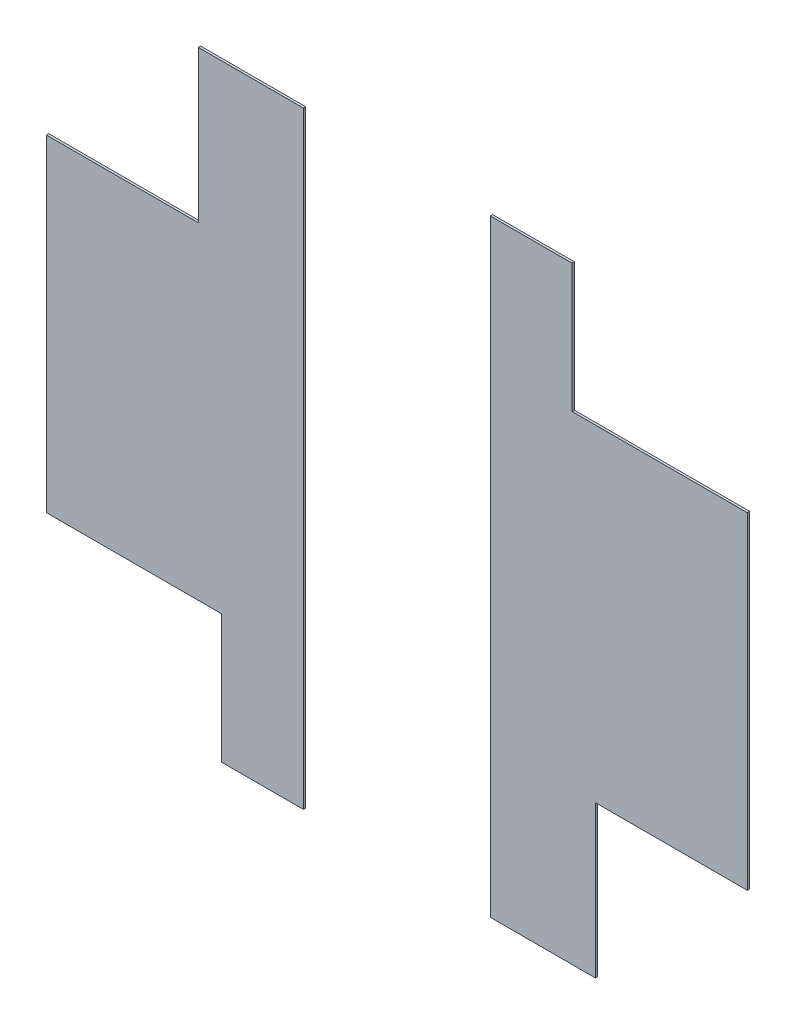
ISO-10303-21;
HEADER;
FILE_DESCRIPTION(('STEP AP214'),'2;1');
FILE_NAME('part.step','',(''),(''),'','','');
FILE_SCHEMA(('AUTOMOTIVE_DESIGN { 1 0 10303 214 1 1 1 1 }'));
ENDSEC;
DATA;
#1=APPLICATION_CONTEXT('core data for automotive mechanical design processes');
#2=APPLICATION_PROTOCOL_DEFINITION('international standard','automotive_design',2000,#1);
#3=PRODUCT_CONTEXT('',#1,'mechanical');
#4=PRODUCT('Part','Part','',(#3));
#5=PRODUCT_RELATED_PRODUCT_CATEGORY('part','',(#4));
#6=PRODUCT_DEFINITION_FORMATION('','',#4);
#7=PRODUCT_DEFINITION_CONTEXT('part definition',#1,'design');
#8=PRODUCT_DEFINITION('design','',#6,#7);
#9=PRODUCT_DEFINITION_SHAPE('','',#8);
#10=(LENGTH_UNIT() NAMED_UNIT(*) SI_UNIT(.MILLI.,.METRE.));
#11=(NAMED_UNIT(*) PLANE_ANGLE_UNIT() SI_UNIT($,.RADIAN.));
#12=(NAMED_UNIT(*) SI_UNIT($,.STERADIAN.) SOLID_ANGLE_UNIT());
#13=UNCERTAINTY_MEASURE_WITH_UNIT(LENGTH_MEASURE(1.E-05),#10,'distance_accuracy_value','');
#14=(GEOMETRIC_REPRESENTATION_CONTEXT(3) GLOBAL_UNCERTAINTY_ASSIGNED_CONTEXT((#13)) GLOBAL_UNIT_ASSIGNED_CONTEXT((#10,
#11,#12)) REPRESENTATION_CONTEXT('',''));
#15=CARTESIAN_POINT('',(0.,0.,0.));
#16=DIRECTION('',(0.,0.,1.));
#17=DIRECTION('',(1.,0.,0.));
#18=AXIS2_PLACEMENT_3D('',#15,#16,#17);
#19=CARTESIAN_POINT('',(0.,660.4,2.54));
#20=DIRECTION('',(0.,-1.,0.));
#21=DIRECTION('',(0.,0.,-1.));
#22=AXIS2_PLACEMENT_3D('',#19,#20,#21);
#23=PLANE('',#22);
#24=DIRECTION('',(-1.,0.,0.));
#25=VECTOR('',#24,1.);
#26=CARTESIAN_POINT('',(0.,660.4,0.));
#27=LINE('',#26,#25);
#28=CARTESIAN_POINT('',(-190.5,660.4,0.));
#29=VERTEX_POINT('',#28);
#30=CARTESIAN_POINT('',(-279.4,660.4,0.));
#31=VERTEX_POINT('',#30);
#32=EDGE_CURVE('E49',#29,#31,#27,.T.);
#33=ORIENTED_EDGE('',*,*,#32,.T.);
#34=DIRECTION('',(0.,0.,1.));
#35=VECTOR('',#34,1.);
#36=CARTESIAN_POINT('',(-279.4,660.4,0.));
#37=LINE('',#36,#35);
#38=CARTESIAN_POINT('',(-279.4,660.4,2.54));
#39=VERTEX_POINT('',#38);
#40=EDGE_CURVE('E139',#31,#39,#37,.T.);
#41=ORIENTED_EDGE('',*,*,#40,.T.);
#42=DIRECTION('',(-1.,0.,0.));
#43=VECTOR('',#42,1.);
#44=CARTESIAN_POINT('',(0.,660.4,2.54));
#45=LINE('',#44,#43);
#46=CARTESIAN_POINT('',(-190.5,660.4,2.54));
#47=VERTEX_POINT('',#46);
#48=EDGE_CURVE('E168',#47,#39,#45,.T.);
#49=ORIENTED_EDGE('',*,*,#48,.F.);
#50=DIRECTION('',(0.,0.,1.));
#51=VECTOR('',#50,1.);
#52=CARTESIAN_POINT('',(-190.5,660.4,0.));
#53=LINE('',#52,#51);
#54=EDGE_CURVE('E133',#29,#47,#53,.T.);
#55=ORIENTED_EDGE('',*,*,#54,.F.);
#56=EDGE_LOOP('',(#33,#41,#49,#55));
#57=FACE_BOUND('',#56,.T.);
#58=ADVANCED_FACE('F46',(#57),#23,.F.);
#59=CARTESIAN_POINT('',(0.,0.,2.54));
#60=DIRECTION('',(0.,1.,0.));
#61=DIRECTION('',(0.,0.,1.));
#62=AXIS2_PLACEMENT_3D('',#59,#60,#61);
#63=PLANE('',#62);
#64=DIRECTION('',(1.,0.,0.));
#65=VECTOR('',#64,1.);
#66=CARTESIAN_POINT('',(0.,0.,2.54));
#67=LINE('',#66,#65);
#68=CARTESIAN_POINT('',(-279.4,0.,2.54));
#69=VERTEX_POINT('',#68);
#70=CARTESIAN_POINT('',(-165.1,0.,2.54));
#71=VERTEX_POINT('',#70);
#72=EDGE_CURVE('E115',#69,#71,#67,.T.);
#73=ORIENTED_EDGE('',*,*,#72,.F.);
#74=DIRECTION('',(0.,0.,1.));
#75=VECTOR('',#74,1.);
#76=CARTESIAN_POINT('',(-279.4,0.,0.));
#77=LINE('',#76,#75);
#78=CARTESIAN_POINT('',(-279.4,0.,0.));
#79=VERTEX_POINT('',#78);
#80=EDGE_CURVE('E12',#79,#69,#77,.T.);
#81=ORIENTED_EDGE('',*,*,#80,.F.);
#82=DIRECTION('',(1.,0.,0.));
#83=VECTOR('',#82,1.);
#84=CARTESIAN_POINT('',(0.,0.,0.));
#85=LINE('',#84,#83);
#86=CARTESIAN_POINT('',(-165.1,0.,0.));
#87=VERTEX_POINT('',#86);
#88=EDGE_CURVE('E137',#79,#87,#85,.T.);
#89=ORIENTED_EDGE('',*,*,#88,.T.);
#90=DIRECTION('',(0.,0.,1.));
#91=VECTOR('',#90,1.);
#92=CARTESIAN_POINT('',(-165.1,0.,0.));
#93=LINE('',#92,#91);
#94=EDGE_CURVE('E123',#87,#71,#93,.T.);
#95=ORIENTED_EDGE('',*,*,#94,.T.);
#96=EDGE_LOOP('',(#73,#81,#89,#95));
#97=FACE_BOUND('',#96,.T.);
#98=ADVANCED_FACE('F135',(#97),#63,.F.);
#99=CARTESIAN_POINT('',(0.,0.,2.54));
#100=DIRECTION('',(0.,0.,1.));
#101=DIRECTION('',(1.,0.,0.));
#102=AXIS2_PLACEMENT_3D('',#99,#100,#101);
#103=PLANE('',#102);
#104=DIRECTION('',(0.,1.,0.));
#105=VECTOR('',#104,1.);
#106=CARTESIAN_POINT('',(-279.4,660.4,2.54));
#107=LINE('',#106,#105);
#108=EDGE_CURVE('E55',#69,#39,#107,.T.);
#109=ORIENTED_EDGE('',*,*,#108,.F.);
#110=ORIENTED_EDGE('',*,*,#72,.T.);
#111=DIRECTION('',(0.,-1.,0.));
#112=VECTOR('',#111,1.);
#113=CARTESIAN_POINT('',(-165.1,0.,2.54));
#114=LINE('',#113,#112);
#115=CARTESIAN_POINT('',(-165.1,165.1,2.54));
#116=VERTEX_POINT('',#115);
#117=EDGE_CURVE('E118',#116,#71,#114,.T.);
#118=ORIENTED_EDGE('',*,*,#117,.F.);
#119=DIRECTION('',(-1.,0.,0.));
#120=VECTOR('',#119,1.);
#121=CARTESIAN_POINT('',(0.,165.1,2.54));
#122=LINE('',#121,#120);
#123=CARTESIAN_POINT('',(0.,165.1,2.54));
#124=VERTEX_POINT('',#123);
#125=EDGE_CURVE('E143',#124,#116,#122,.T.);
#126=ORIENTED_EDGE('',*,*,#125,.F.);
#127=DIRECTION('',(0.,1.,0.));
#128=VECTOR('',#127,1.);
#129=CARTESIAN_POINT('',(0.,0.,2.54));
#130=LINE('',#129,#128);
#131=CARTESIAN_POINT('',(0.,520.7,2.54));
#132=VERTEX_POINT('',#131);
#133=EDGE_CURVE('E122',#124,#132,#130,.T.);
#134=ORIENTED_EDGE('',*,*,#133,.T.);
#135=DIRECTION('',(1.,0.,0.));
#136=VECTOR('',#135,1.);
#137=CARTESIAN_POINT('',(0.,520.7,2.54));
#138=LINE('',#137,#136);
#139=CARTESIAN_POINT('',(-190.5,520.7,2.54));
#140=VERTEX_POINT('',#139);
#141=EDGE_CURVE('E155',#140,#132,#138,.T.);
#142=ORIENTED_EDGE('',*,*,#141,.F.);
#143=DIRECTION('',(0.,-1.,0.));
#144=VECTOR('',#143,1.);
#145=CARTESIAN_POINT('',(-190.5,660.4,2.54));
#146=LINE('',#145,#144);
#147=EDGE_CURVE('E152',#47,#140,#146,.T.);
#148=ORIENTED_EDGE('',*,*,#147,.F.);
#149=ORIENTED_EDGE('',*,*,#48,.T.);
#150=EDGE_LOOP('',(#109,#110,#118,#126,#134,#142,#148,#149));
#151=FACE_BOUND('',#150,.T.);
#152=ADVANCED_FACE('F117',(#151),#103,.T.);
#153=CARTESIAN_POINT('',(0.,0.,0.));
#154=DIRECTION('',(0.,0.,1.));
#155=DIRECTION('',(1.,0.,0.));
#156=AXIS2_PLACEMENT_3D('',#153,#154,#155);
#157=PLANE('',#156);
#158=ORIENTED_EDGE('',*,*,#88,.F.);
#159=DIRECTION('',(0.,1.,0.));
#160=VECTOR('',#159,1.);
#161=CARTESIAN_POINT('',(-279.4,660.4,0.));
#162=LINE('',#161,#160);
#163=EDGE_CURVE('E164',#79,#31,#162,.T.);
#164=ORIENTED_EDGE('',*,*,#163,.T.);
#165=ORIENTED_EDGE('',*,*,#32,.F.);
#166=DIRECTION('',(0.,-1.,0.));
#167=VECTOR('',#166,1.);
#168=CARTESIAN_POINT('',(-190.5,660.4,0.));
#169=LINE('',#168,#167);
#170=CARTESIAN_POINT('',(-190.5,520.7,0.));
#171=VERTEX_POINT('',#170);
#172=EDGE_CURVE('E161',#29,#171,#169,.T.);
#173=ORIENTED_EDGE('',*,*,#172,.T.);
#174=DIRECTION('',(1.,0.,0.));
#175=VECTOR('',#174,1.);
#176=CARTESIAN_POINT('',(0.,520.7,0.));
#177=LINE('',#176,#175);
#178=CARTESIAN_POINT('',(0.,520.7,0.));
#179=VERTEX_POINT('',#178);
#180=EDGE_CURVE('E108',#171,#179,#177,.T.);
#181=ORIENTED_EDGE('',*,*,#180,.T.);
#182=DIRECTION('',(0.,1.,0.));
#183=VECTOR('',#182,1.);
#184=CARTESIAN_POINT('',(0.,0.,0.));
#185=LINE('',#184,#183);
#186=CARTESIAN_POINT('',(0.,165.1,0.));
#187=VERTEX_POINT('',#186);
#188=EDGE_CURVE('E147',#187,#179,#185,.T.);
#189=ORIENTED_EDGE('',*,*,#188,.F.);
#190=DIRECTION('',(-1.,0.,0.));
#191=VECTOR('',#190,1.);
#192=CARTESIAN_POINT('',(0.,165.1,0.));
#193=LINE('',#192,#191);
#194=CARTESIAN_POINT('',(-165.1,165.1,0.));
#195=VERTEX_POINT('',#194);
#196=EDGE_CURVE('E148',#187,#195,#193,.T.);
#197=ORIENTED_EDGE('',*,*,#196,.T.);
#198=DIRECTION('',(0.,-1.,0.));
#199=VECTOR('',#198,1.);
#200=CARTESIAN_POINT('',(-165.1,0.,0.));
#201=LINE('',#200,#199);
#202=EDGE_CURVE('E145',#195,#87,#201,.T.);
#203=ORIENTED_EDGE('',*,*,#202,.T.);
#204=EDGE_LOOP('',(#158,#164,#165,#173,#181,#189,#197,#203));
#205=FACE_BOUND('',#204,.T.);
#206=ADVANCED_FACE('F182',(#205),#157,.F.);
#207=CARTESIAN_POINT('',(0.,0.,2.54));
#208=DIRECTION('',(-1.,0.,0.));
#209=DIRECTION('',(0.,-1.,0.));
#210=AXIS2_PLACEMENT_3D('',#207,#208,#209);
#211=PLANE('',#210);
#212=ORIENTED_EDGE('',*,*,#133,.F.);
#213=DIRECTION('',(0.,0.,1.));
#214=VECTOR('',#213,1.);
#215=CARTESIAN_POINT('',(0.,165.1,0.));
#216=LINE('',#215,#214);
#217=EDGE_CURVE('E79',#187,#124,#216,.T.);
#218=ORIENTED_EDGE('',*,*,#217,.F.);
#219=ORIENTED_EDGE('',*,*,#188,.T.);
#220=DIRECTION('',(0.,0.,1.));
#221=VECTOR('',#220,1.);
#222=CARTESIAN_POINT('',(0.,520.7,0.));
#223=LINE('',#222,#221);
#224=EDGE_CURVE('E105',#179,#132,#223,.T.);
#225=ORIENTED_EDGE('',*,*,#224,.T.);
#226=EDGE_LOOP('',(#212,#218,#219,#225));
#227=FACE_BOUND('',#226,.T.);
#228=ADVANCED_FACE('F180',(#227),#211,.F.);
#229=CARTESIAN_POINT('',(0.,520.7,0.));
#230=DIRECTION('',(0.,-1.,0.));
#231=DIRECTION('',(0.,0.,-1.));
#232=AXIS2_PLACEMENT_3D('',#229,#230,#231);
#233=PLANE('',#232);
#234=ORIENTED_EDGE('',*,*,#141,.T.);
#235=ORIENTED_EDGE('',*,*,#224,.F.);
#236=ORIENTED_EDGE('',*,*,#180,.F.);
#237=DIRECTION('',(0.,0.,1.));
#238=VECTOR('',#237,1.);
#239=CARTESIAN_POINT('',(-190.5,520.7,0.));
#240=LINE('',#239,#238);
#241=EDGE_CURVE('E153',#171,#140,#240,.T.);
#242=ORIENTED_EDGE('',*,*,#241,.T.);
#243=EDGE_LOOP('',(#234,#235,#236,#242));
#244=FACE_BOUND('',#243,.T.);
#245=ADVANCED_FACE('F212',(#244),#233,.F.);
#246=CARTESIAN_POINT('',(-190.5,660.4,0.));
#247=DIRECTION('',(-1.,0.,0.));
#248=DIRECTION('',(0.,-1.,0.));
#249=AXIS2_PLACEMENT_3D('',#246,#247,#248);
#250=PLANE('',#249);
#251=ORIENTED_EDGE('',*,*,#147,.T.);
#252=ORIENTED_EDGE('',*,*,#241,.F.);
#253=ORIENTED_EDGE('',*,*,#172,.F.);
#254=ORIENTED_EDGE('',*,*,#54,.T.);
#255=EDGE_LOOP('',(#251,#252,#253,#254));
#256=FACE_BOUND('',#255,.T.);
#257=ADVANCED_FACE('F188',(#256),#250,.F.);
#258=CARTESIAN_POINT('',(-165.1,0.,0.));
#259=DIRECTION('',(-1.,0.,0.));
#260=DIRECTION('',(0.,0.,1.));
#261=AXIS2_PLACEMENT_3D('',#258,#259,#260);
#262=PLANE('',#261);
#263=ORIENTED_EDGE('',*,*,#117,.T.);
#264=ORIENTED_EDGE('',*,*,#94,.F.);
#265=ORIENTED_EDGE('',*,*,#202,.F.);
#266=DIRECTION('',(0.,0.,1.));
#267=VECTOR('',#266,1.);
#268=CARTESIAN_POINT('',(-165.1,165.1,0.));
#269=LINE('',#268,#267);
#270=EDGE_CURVE('E132',#195,#116,#269,.T.);
#271=ORIENTED_EDGE('',*,*,#270,.T.);
#272=EDGE_LOOP('',(#263,#264,#265,#271));
#273=FACE_BOUND('',#272,.T.);
#274=ADVANCED_FACE('F128',(#273),#262,.F.);
#275=CARTESIAN_POINT('',(0.,165.1,0.));
#276=DIRECTION('',(0.,1.,0.));
#277=DIRECTION('',(-1.,0.,0.));
#278=AXIS2_PLACEMENT_3D('',#275,#276,#277);
#279=PLANE('',#278);
#280=ORIENTED_EDGE('',*,*,#125,.T.);
#281=ORIENTED_EDGE('',*,*,#270,.F.);
#282=ORIENTED_EDGE('',*,*,#196,.F.);
#283=ORIENTED_EDGE('',*,*,#217,.T.);
#284=EDGE_LOOP('',(#280,#281,#282,#283));
#285=FACE_BOUND('',#284,.T.);
#286=ADVANCED_FACE('F191',(#285),#279,.F.);
#287=CARTESIAN_POINT('',(-279.4,660.4,0.));
#288=DIRECTION('',(1.,0.,0.));
#289=DIRECTION('',(0.,0.,-1.));
#290=AXIS2_PLACEMENT_3D('',#287,#288,#289);
#291=PLANE('',#290);
#292=ORIENTED_EDGE('',*,*,#108,.T.);
#293=ORIENTED_EDGE('',*,*,#40,.F.);
#294=ORIENTED_EDGE('',*,*,#163,.F.);
#295=ORIENTED_EDGE('',*,*,#80,.T.);
#296=EDGE_LOOP('',(#292,#293,#294,#295));
#297=FACE_BOUND('',#296,.T.);
#298=ADVANCED_FACE('F190',(#297),#291,.F.);
#299=CLOSED_SHELL('',(#58,#98,#152,#206,#228,#245,#257,#274,#286,#298));
#300=MANIFOLD_SOLID_BREP('B2',#299);
#301=CARTESIAN_POINT('',(-596.9,660.4,0.));
#302=DIRECTION('',(1.,0.,0.));
#303=DIRECTION('',(0.,0.,-1.));
#304=AXIS2_PLACEMENT_3D('',#301,#302,#303);
#305=PLANE('',#304);
#306=DIRECTION('',(0.,1.,0.));
#307=VECTOR('',#306,1.);
#308=CARTESIAN_POINT('',(-596.9,660.4,2.54));
#309=LINE('',#308,#307);
#310=CARTESIAN_POINT('',(-596.9,495.3,2.54));
#311=VERTEX_POINT('',#310);
#312=CARTESIAN_POINT('',(-596.9,660.4,2.54));
#313=VERTEX_POINT('',#312);
#314=EDGE_CURVE('E372',#311,#313,#309,.T.);
#315=ORIENTED_EDGE('',*,*,#314,.T.);
#316=DIRECTION('',(0.,0.,1.));
#317=VECTOR('',#316,1.);
#318=CARTESIAN_POINT('',(-596.9,660.4,0.));
#319=LINE('',#318,#317);
#320=CARTESIAN_POINT('',(-596.9,660.4,0.));
#321=VERTEX_POINT('',#320);
#322=EDGE_CURVE('E360',#321,#313,#319,.T.);
#323=ORIENTED_EDGE('',*,*,#322,.F.);
#324=DIRECTION('',(0.,1.,0.));
#325=VECTOR('',#324,1.);
#326=CARTESIAN_POINT('',(-596.9,660.4,0.));
#327=LINE('',#326,#325);
#328=CARTESIAN_POINT('',(-596.9,495.3,0.));
#329=VERTEX_POINT('',#328);
#330=EDGE_CURVE('E358',#329,#321,#327,.T.);
#331=ORIENTED_EDGE('',*,*,#330,.F.);
#332=DIRECTION('',(0.,0.,1.));
#333=VECTOR('',#332,1.);
#334=CARTESIAN_POINT('',(-596.9,495.3,0.));
#335=LINE('',#334,#333);
#336=EDGE_CURVE('E363',#329,#311,#335,.T.);
#337=ORIENTED_EDGE('',*,*,#336,.T.);
#338=EDGE_LOOP('',(#315,#323,#331,#337));
#339=FACE_BOUND('',#338,.T.);
#340=ADVANCED_FACE('F273',(#339),#305,.F.);
#341=CARTESIAN_POINT('',(-762.,495.3,0.));
#342=DIRECTION('',(0.,-1.,0.));
#343=DIRECTION('',(0.,0.,-1.));
#344=AXIS2_PLACEMENT_3D('',#341,#342,#343);
#345=PLANE('',#344);
#346=DIRECTION('',(1.,0.,0.));
#347=VECTOR('',#346,1.);
#348=CARTESIAN_POINT('',(-762.,495.3,2.54));
#349=LINE('',#348,#347);
#350=CARTESIAN_POINT('',(-762.,495.3,2.54));
#351=VERTEX_POINT('',#350);
#352=EDGE_CURVE('E376',#351,#311,#349,.T.);
#353=ORIENTED_EDGE('',*,*,#352,.T.);
#354=ORIENTED_EDGE('',*,*,#336,.F.);
#355=DIRECTION('',(1.,0.,0.));
#356=VECTOR('',#355,1.);
#357=CARTESIAN_POINT('',(-762.,495.3,0.));
#358=LINE('',#357,#356);
#359=CARTESIAN_POINT('',(-762.,495.3,0.));
#360=VERTEX_POINT('',#359);
#361=EDGE_CURVE('E375',#360,#329,#358,.T.);
#362=ORIENTED_EDGE('',*,*,#361,.F.);
#363=DIRECTION('',(0.,0.,1.));
#364=VECTOR('',#363,1.);
#365=CARTESIAN_POINT('',(-762.,495.3,0.));
#366=LINE('',#365,#364);
#367=EDGE_CURVE('E369',#360,#351,#366,.T.);
#368=ORIENTED_EDGE('',*,*,#367,.T.);
#369=EDGE_LOOP('',(#353,#354,#362,#368));
#370=FACE_BOUND('',#369,.T.);
#371=ADVANCED_FACE('F415',(#370),#345,.F.);
#372=CARTESIAN_POINT('',(-762.,0.,2.54));
#373=DIRECTION('',(1.,0.,0.));
#374=DIRECTION('',(0.,0.,-1.));
#375=AXIS2_PLACEMENT_3D('',#372,#373,#374);
#376=PLANE('',#375);
#377=DIRECTION('',(0.,-1.,0.));
#378=VECTOR('',#377,1.);
#379=CARTESIAN_POINT('',(-762.,0.,0.));
#380=LINE('',#379,#378);
#381=CARTESIAN_POINT('',(-762.,139.7,0.));
#382=VERTEX_POINT('',#381);
#383=EDGE_CURVE('E359',#360,#382,#380,.T.);
#384=ORIENTED_EDGE('',*,*,#383,.T.);
#385=DIRECTION('',(0.,0.,1.));
#386=VECTOR('',#385,1.);
#387=CARTESIAN_POINT('',(-762.,139.7,0.));
#388=LINE('',#387,#386);
#389=CARTESIAN_POINT('',(-762.,139.7,2.54));
#390=VERTEX_POINT('',#389);
#391=EDGE_CURVE('E379',#382,#390,#388,.T.);
#392=ORIENTED_EDGE('',*,*,#391,.T.);
#393=DIRECTION('',(0.,-1.,0.));
#394=VECTOR('',#393,1.);
#395=CARTESIAN_POINT('',(-762.,0.,2.54));
#396=LINE('',#395,#394);
#397=EDGE_CURVE('E282',#351,#390,#396,.T.);
#398=ORIENTED_EDGE('',*,*,#397,.F.);
#399=ORIENTED_EDGE('',*,*,#367,.F.);
#400=EDGE_LOOP('',(#384,#392,#398,#399));
#401=FACE_BOUND('',#400,.T.);
#402=ADVANCED_FACE('F411',(#401),#376,.F.);
#403=CARTESIAN_POINT('',(-762.,139.7,0.));
#404=DIRECTION('',(0.,1.,0.));
#405=DIRECTION('',(0.,0.,1.));
#406=AXIS2_PLACEMENT_3D('',#403,#404,#405);
#407=PLANE('',#406);
#408=DIRECTION('',(-1.,0.,0.));
#409=VECTOR('',#408,1.);
#410=CARTESIAN_POINT('',(-762.,139.7,2.54));
#411=LINE('',#410,#409);
#412=CARTESIAN_POINT('',(-571.5,139.7,2.54));
#413=VERTEX_POINT('',#412);
#414=EDGE_CURVE('E388',#413,#390,#411,.T.);
#415=ORIENTED_EDGE('',*,*,#414,.T.);
#416=ORIENTED_EDGE('',*,*,#391,.F.);
#417=DIRECTION('',(-1.,0.,0.));
#418=VECTOR('',#417,1.);
#419=CARTESIAN_POINT('',(-762.,139.7,0.));
#420=LINE('',#419,#418);
#421=CARTESIAN_POINT('',(-571.5,139.7,0.));
#422=VERTEX_POINT('',#421);
#423=EDGE_CURVE('E298',#422,#382,#420,.T.);
#424=ORIENTED_EDGE('',*,*,#423,.F.);
#425=DIRECTION('',(0.,0.,1.));
#426=VECTOR('',#425,1.);
#427=CARTESIAN_POINT('',(-571.5,139.7,0.));
#428=LINE('',#427,#426);
#429=EDGE_CURVE('E384',#422,#413,#428,.T.);
#430=ORIENTED_EDGE('',*,*,#429,.T.);
#431=EDGE_LOOP('',(#415,#416,#424,#430));
#432=FACE_BOUND('',#431,.T.);
#433=ADVANCED_FACE('F434',(#432),#407,.F.);
#434=CARTESIAN_POINT('',(-571.5,0.,0.));
#435=DIRECTION('',(1.,0.,0.));
#436=DIRECTION('',(0.,0.,-1.));
#437=AXIS2_PLACEMENT_3D('',#434,#435,#436);
#438=PLANE('',#437);
#439=DIRECTION('',(0.,1.,0.));
#440=VECTOR('',#439,1.);
#441=CARTESIAN_POINT('',(-571.5,0.,2.54));
#442=LINE('',#441,#440);
#443=CARTESIAN_POINT('',(-571.5,0.,2.54));
#444=VERTEX_POINT('',#443);
#445=EDGE_CURVE('E391',#444,#413,#442,.T.);
#446=ORIENTED_EDGE('',*,*,#445,.T.);
#447=ORIENTED_EDGE('',*,*,#429,.F.);
#448=DIRECTION('',(0.,1.,0.));
#449=VECTOR('',#448,1.);
#450=CARTESIAN_POINT('',(-571.5,0.,0.));
#451=LINE('',#450,#449);
#452=CARTESIAN_POINT('',(-571.5,0.,0.));
#453=VERTEX_POINT('',#452);
#454=EDGE_CURVE('E390',#453,#422,#451,.T.);
#455=ORIENTED_EDGE('',*,*,#454,.F.);
#456=DIRECTION('',(0.,0.,1.));
#457=VECTOR('',#456,1.);
#458=CARTESIAN_POINT('',(-571.5,0.,0.));
#459=LINE('',#458,#457);
#460=EDGE_CURVE('E382',#453,#444,#459,.T.);
#461=ORIENTED_EDGE('',*,*,#460,.T.);
#462=EDGE_LOOP('',(#446,#447,#455,#461));
#463=FACE_BOUND('',#462,.T.);
#464=ADVANCED_FACE('F407',(#463),#438,.F.);
#465=CARTESIAN_POINT('',(0.,0.,2.54));
#466=DIRECTION('',(0.,0.,1.));
#467=DIRECTION('',(1.,0.,0.));
#468=AXIS2_PLACEMENT_3D('',#465,#466,#467);
#469=PLANE('',#468);
#470=DIRECTION('',(0.,-1.,0.));
#471=VECTOR('',#470,1.);
#472=CARTESIAN_POINT('',(-482.6,660.4,2.54));
#473=LINE('',#472,#471);
#474=CARTESIAN_POINT('',(-482.6,660.4,2.54));
#475=VERTEX_POINT('',#474);
#476=CARTESIAN_POINT('',(-482.6,0.,2.54));
#477=VERTEX_POINT('',#476);
#478=EDGE_CURVE('E346',#475,#477,#473,.T.);
#479=ORIENTED_EDGE('',*,*,#478,.F.);
#480=DIRECTION('',(-1.,0.,0.));
#481=VECTOR('',#480,1.);
#482=CARTESIAN_POINT('',(0.,660.4,2.54));
#483=LINE('',#482,#481);
#484=EDGE_CURVE('E353',#475,#313,#483,.T.);
#485=ORIENTED_EDGE('',*,*,#484,.T.);
#486=ORIENTED_EDGE('',*,*,#314,.F.);
#487=ORIENTED_EDGE('',*,*,#352,.F.);
#488=ORIENTED_EDGE('',*,*,#397,.T.);
#489=ORIENTED_EDGE('',*,*,#414,.F.);
#490=ORIENTED_EDGE('',*,*,#445,.F.);
#491=DIRECTION('',(1.,0.,0.));
#492=VECTOR('',#491,1.);
#493=CARTESIAN_POINT('',(0.,0.,2.54));
#494=LINE('',#493,#492);
#495=EDGE_CURVE('E44',#444,#477,#494,.T.);
#496=ORIENTED_EDGE('',*,*,#495,.T.);
#497=EDGE_LOOP('',(#479,#485,#486,#487,#488,#489,#490,#496));
#498=FACE_BOUND('',#497,.T.);
#499=ADVANCED_FACE('F404',(#498),#469,.T.);
#500=CARTESIAN_POINT('',(0.,0.,0.));
#501=DIRECTION('',(0.,0.,1.));
#502=DIRECTION('',(1.,0.,0.));
#503=AXIS2_PLACEMENT_3D('',#500,#501,#502);
#504=PLANE('',#503);
#505=DIRECTION('',(-1.,0.,0.));
#506=VECTOR('',#505,1.);
#507=CARTESIAN_POINT('',(0.,660.4,0.));
#508=LINE('',#507,#506);
#509=CARTESIAN_POINT('',(-482.6,660.4,0.));
#510=VERTEX_POINT('',#509);
#511=EDGE_CURVE('E351',#510,#321,#508,.T.);
#512=ORIENTED_EDGE('',*,*,#511,.F.);
#513=DIRECTION('',(0.,-1.,0.));
#514=VECTOR('',#513,1.);
#515=CARTESIAN_POINT('',(-482.6,660.4,0.));
#516=LINE('',#515,#514);
#517=CARTESIAN_POINT('',(-482.6,0.,0.));
#518=VERTEX_POINT('',#517);
#519=EDGE_CURVE('E337',#510,#518,#516,.T.);
#520=ORIENTED_EDGE('',*,*,#519,.T.);
#521=DIRECTION('',(1.,0.,0.));
#522=VECTOR('',#521,1.);
#523=CARTESIAN_POINT('',(0.,0.,0.));
#524=LINE('',#523,#522);
#525=EDGE_CURVE('E277',#453,#518,#524,.T.);
#526=ORIENTED_EDGE('',*,*,#525,.F.);
#527=ORIENTED_EDGE('',*,*,#454,.T.);
#528=ORIENTED_EDGE('',*,*,#423,.T.);
#529=ORIENTED_EDGE('',*,*,#383,.F.);
#530=ORIENTED_EDGE('',*,*,#361,.T.);
#531=ORIENTED_EDGE('',*,*,#330,.T.);
#532=EDGE_LOOP('',(#512,#520,#526,#527,#528,#529,#530,#531));
#533=FACE_BOUND('',#532,.T.);
#534=ADVANCED_FACE('F356',(#533),#504,.F.);
#535=CARTESIAN_POINT('',(0.,0.,2.54));
#536=DIRECTION('',(0.,1.,0.));
#537=DIRECTION('',(0.,0.,1.));
#538=AXIS2_PLACEMENT_3D('',#535,#536,#537);
#539=PLANE('',#538);
#540=ORIENTED_EDGE('',*,*,#525,.T.);
#541=DIRECTION('',(0.,0.,1.));
#542=VECTOR('',#541,1.);
#543=CARTESIAN_POINT('',(-482.6,0.,0.));
#544=LINE('',#543,#542);
#545=EDGE_CURVE('E290',#518,#477,#544,.T.);
#546=ORIENTED_EDGE('',*,*,#545,.T.);
#547=ORIENTED_EDGE('',*,*,#495,.F.);
#548=ORIENTED_EDGE('',*,*,#460,.F.);
#549=EDGE_LOOP('',(#540,#546,#547,#548));
#550=FACE_BOUND('',#549,.T.);
#551=ADVANCED_FACE('F401',(#550),#539,.F.);
#552=CARTESIAN_POINT('',(0.,660.4,2.54));
#553=DIRECTION('',(0.,-1.,0.));
#554=DIRECTION('',(0.,0.,-1.));
#555=AXIS2_PLACEMENT_3D('',#552,#553,#554);
#556=PLANE('',#555);
#557=ORIENTED_EDGE('',*,*,#484,.F.);
#558=DIRECTION('',(0.,0.,1.));
#559=VECTOR('',#558,1.);
#560=CARTESIAN_POINT('',(-482.6,660.4,0.));
#561=LINE('',#560,#559);
#562=EDGE_CURVE('E340',#510,#475,#561,.T.);
#563=ORIENTED_EDGE('',*,*,#562,.F.);
#564=ORIENTED_EDGE('',*,*,#511,.T.);
#565=ORIENTED_EDGE('',*,*,#322,.T.);
#566=EDGE_LOOP('',(#557,#563,#564,#565));
#567=FACE_BOUND('',#566,.T.);
#568=ADVANCED_FACE('F275',(#567),#556,.F.);
#569=CARTESIAN_POINT('',(-482.6,660.4,0.));
#570=DIRECTION('',(-1.,0.,0.));
#571=DIRECTION('',(0.,0.,1.));
#572=AXIS2_PLACEMENT_3D('',#569,#570,#571);
#573=PLANE('',#572);
#574=ORIENTED_EDGE('',*,*,#478,.T.);
#575=ORIENTED_EDGE('',*,*,#545,.F.);
#576=ORIENTED_EDGE('',*,*,#519,.F.);
#577=ORIENTED_EDGE('',*,*,#562,.T.);
#578=EDGE_LOOP('',(#574,#575,#576,#577));
#579=FACE_BOUND('',#578,.T.);
#580=ADVANCED_FACE('F339',(#579),#573,.F.);
#581=CLOSED_SHELL('',(#340,#371,#402,#433,#464,#499,#534,#551,#568,#580));
#582=MANIFOLD_SOLID_BREP('B6',#581);
#583=ADVANCED_BREP_SHAPE_REPRESENTATION('',(#18,#300,#582),#14);
#584=SHAPE_DEFINITION_REPRESENTATION(#9,#583);
ENDSEC;
END-ISO-10303-21;
